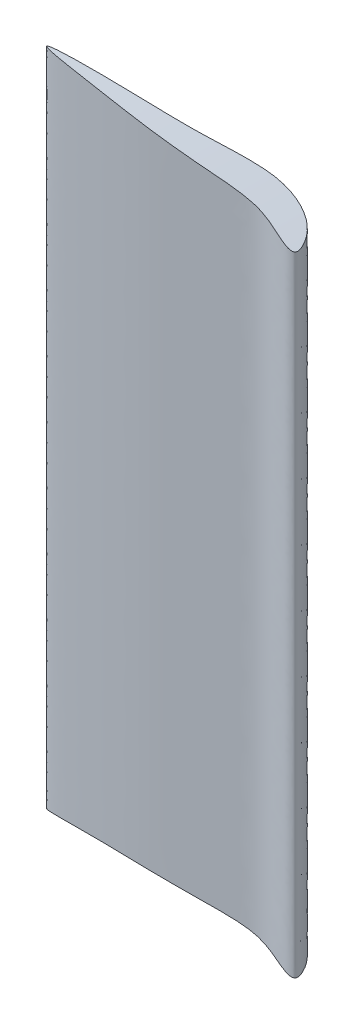
ISO-10303-21;
HEADER;
FILE_DESCRIPTION(('STEP AP214'),'2;1');
FILE_NAME('part.step','',(''),(''),'','','');
FILE_SCHEMA(('AUTOMOTIVE_DESIGN { 1 0 10303 214 1 1 1 1 }'));
ENDSEC;
DATA;
#1=APPLICATION_CONTEXT('core data for automotive mechanical design processes');
#2=APPLICATION_PROTOCOL_DEFINITION('international standard','automotive_design',2000,#1);
#3=PRODUCT_CONTEXT('',#1,'mechanical');
#4=PRODUCT('Part','Part','',(#3));
#5=PRODUCT_RELATED_PRODUCT_CATEGORY('part','',(#4));
#6=PRODUCT_DEFINITION_FORMATION('','',#4);
#7=PRODUCT_DEFINITION_CONTEXT('part definition',#1,'design');
#8=PRODUCT_DEFINITION('design','',#6,#7);
#9=PRODUCT_DEFINITION_SHAPE('','',#8);
#10=(LENGTH_UNIT() NAMED_UNIT(*) SI_UNIT(.MILLI.,.METRE.));
#11=(NAMED_UNIT(*) PLANE_ANGLE_UNIT() SI_UNIT($,.RADIAN.));
#12=(NAMED_UNIT(*) SI_UNIT($,.STERADIAN.) SOLID_ANGLE_UNIT());
#13=UNCERTAINTY_MEASURE_WITH_UNIT(LENGTH_MEASURE(1.E-05),#10,'distance_accuracy_value','');
#14=(GEOMETRIC_REPRESENTATION_CONTEXT(3) GLOBAL_UNCERTAINTY_ASSIGNED_CONTEXT((#13)) GLOBAL_UNIT_ASSIGNED_CONTEXT((#10,
#11,#12)) REPRESENTATION_CONTEXT('',''));
#15=CARTESIAN_POINT('',(0.,0.,0.));
#16=DIRECTION('',(0.,0.,1.));
#17=DIRECTION('',(1.,0.,0.));
#18=AXIS2_PLACEMENT_3D('',#15,#16,#17);
#19=CARTESIAN_POINT('',(-3.56013832817807,-13.0754050341932,21.6046688254635));
#20=DIRECTION('',(0.,0.,-1.));
#21=DIRECTION('',(-1.,0.,0.));
#22=AXIS2_PLACEMENT_3D('',#19,#20,#21);
#23=CYLINDRICAL_SURFACE('',#22,27.25);
#24=CARTESIAN_POINT('',(5.,12.7951676653521,-0.750000000000001));
#25=CARTESIAN_POINT('',(4.99909646395222,12.7954666276233,-0.746379155248309));
#26=CARTESIAN_POINT('',(4.99792977551534,12.795852621034,-0.742828291818252));
#27=CARTESIAN_POINT('',(4.99501188741267,12.7968176608269,-0.73600450233631));
#28=CARTESIAN_POINT('',(4.99326154238918,12.7973964249355,-0.732731178625141));
#29=CARTESIAN_POINT('',(4.9891981271379,12.7987394085068,-0.726586410781573));
#30=CARTESIAN_POINT('',(4.98688377777271,12.7995040495202,-0.723715903875301));
#31=CARTESIAN_POINT('',(4.98179633123377,12.8011839925103,-0.718460845472457));
#32=CARTESIAN_POINT('',(4.9790221821627,12.8020996399243,-0.716077436908573));
#33=CARTESIAN_POINT('',(4.96860712719981,12.8055350739611,-0.708488463252215));
#34=CARTESIAN_POINT('',(4.96009109767334,12.8083402906077,-0.704638921559748));
#35=CARTESIAN_POINT('',(4.94306251810073,12.8139393851933,-0.699258508853822));
#36=CARTESIAN_POINT('',(4.9345741578826,12.8167258402116,-0.69761460526237));
#37=CARTESIAN_POINT('',(4.91744380331384,12.8223396986373,-0.695485215199758));
#38=CARTESIAN_POINT('',(4.90880140367437,12.8251672046814,-0.695003459332361));
#39=CARTESIAN_POINT('',(4.88367359157393,12.8333741990826,-0.694706329361638));
#40=CARTESIAN_POINT('',(4.86718752445583,12.8387412059714,-0.69589232741417));
#41=CARTESIAN_POINT('',(4.83434291598546,12.8493993902257,-0.699670235252838));
#42=CARTESIAN_POINT('',(4.81798483106063,12.8546903276383,-0.702265880013931));
#43=CARTESIAN_POINT('',(4.78529258662157,12.8652306489867,-0.708337780627159));
#44=CARTESIAN_POINT('',(4.76895937444478,12.8704794927223,-0.711820000758437));
#45=CARTESIAN_POINT('',(4.73642120859475,12.880902313215,-0.719328953715338));
#46=CARTESIAN_POINT('',(4.72021612360606,12.8860763729015,-0.723355022357228));
#47=CARTESIAN_POINT('',(4.66119933829671,12.9048592466678,-0.738673252443498));
#48=CARTESIAN_POINT('',(4.61860834055863,12.9182979753019,-0.75099276162899));
#49=CARTESIAN_POINT('',(4.53336259081329,12.9449665750558,-0.775673230856061));
#50=CARTESIAN_POINT('',(4.49070782369475,12.9581963833357,-0.788034202062603));
#51=CARTESIAN_POINT('',(4.40484357676347,12.9845944189582,-0.810581022017345));
#52=CARTESIAN_POINT('',(4.36163483047189,12.997762701438,-0.820769484135516));
#53=CARTESIAN_POINT('',(4.27499582407334,13.0239283409396,-0.838103192424338));
#54=CARTESIAN_POINT('',(4.23157136471984,13.036926148387,-0.845275869184779));
#55=CARTESIAN_POINT('',(4.14415865653623,13.0628501631027,-0.855748446837888));
#56=CARTESIAN_POINT('',(4.10016979429247,13.0757762658686,-0.859043695169843));
#57=CARTESIAN_POINT('',(4.01200600693278,13.1014404977618,-0.861686942529994));
#58=CARTESIAN_POINT('',(3.96783096704147,13.1141784786863,-0.861031980189812));
#59=CARTESIAN_POINT('',(3.85806929088971,13.1455284864554,-0.856059070193697));
#60=CARTESIAN_POINT('',(3.7925256970753,13.1639820719973,-0.850113490177182));
#61=CARTESIAN_POINT('',(3.66162703648165,13.2003105251733,-0.834929685093589));
#62=CARTESIAN_POINT('',(3.59627225829291,13.2181847303501,-0.82568782657496));
#63=CARTESIAN_POINT('',(3.46555583080821,13.253413973561,-0.805617018419804));
#64=CARTESIAN_POINT('',(3.40019435221056,13.2707680949965,-0.794785444814362));
#65=CARTESIAN_POINT('',(3.26934601648219,13.3049895839862,-0.77292613038201));
#66=CARTESIAN_POINT('',(3.20385911666969,13.321856732754,-0.761898304872089));
#67=CARTESIAN_POINT('',(3.07178691614817,13.3553490225085,-0.740892511558806));
#68=CARTESIAN_POINT('',(3.00519791793277,13.3719687587286,-0.730928875696276));
#69=CARTESIAN_POINT('',(2.87178119546863,13.4047314341489,-0.71225858611939));
#70=CARTESIAN_POINT('',(2.80495368453999,13.4208747173442,-0.70355100696254));
#71=CARTESIAN_POINT('',(2.67106828403673,13.4526800002158,-0.687392898089642));
#72=CARTESIAN_POINT('',(2.60401052736368,13.4683422380701,-0.679941737806237));
#73=CARTESIAN_POINT('',(2.46967001273835,13.4991817025374,-0.666333638931673));
#74=CARTESIAN_POINT('',(2.40238731350046,13.5143590462305,-0.66017638588692));
#75=CARTESIAN_POINT('',(2.24582471241447,13.5490505165101,-0.647492420946518));
#76=CARTESIAN_POINT('',(2.15646087856322,13.5683815723119,-0.641489027442112));
#77=CARTESIAN_POINT('',(1.97739693138405,13.6061724688391,-0.631998448692735));
#78=CARTESIAN_POINT('',(1.88769674438955,13.6246321050291,-0.628511851460568));
#79=CARTESIAN_POINT('',(1.70804968273522,13.6606584447525,-0.623493584442226));
#80=CARTESIAN_POINT('',(1.61810276278351,13.6782249709136,-0.621962301537935));
#81=CARTESIAN_POINT('',(1.43795027565372,13.7124658170423,-0.620089058999525));
#82=CARTESIAN_POINT('',(1.3477445532182,13.7291393624964,-0.619748115851321));
#83=CARTESIAN_POINT('',(1.16718048068616,13.7615726242201,-0.619810742835714));
#84=CARTESIAN_POINT('',(1.07682214933087,13.7773324453391,-0.620214227370588));
#85=CARTESIAN_POINT('',(0.895963924453455,13.8079367085796,-0.621892001030408));
#86=CARTESIAN_POINT('',(0.805464041882286,13.8227812182382,-0.623166225822893));
#87=CARTESIAN_POINT('',(0.681012756823549,13.8425502224724,-0.625744056756712));
#88=CARTESIAN_POINT('',(0.647112900128085,13.8478695519968,-0.626530328247709));
#89=CARTESIAN_POINT('',(0.579297669197037,13.8583794559965,-0.628311085396864));
#90=CARTESIAN_POINT('',(0.545382294579101,13.8635700271036,-0.629305576495489));
#91=CARTESIAN_POINT('',(0.477610877064721,13.8738111574515,-0.6315526673942));
#92=CARTESIAN_POINT('',(0.443754857310266,13.8788619852003,-0.632804726601933));
#93=CARTESIAN_POINT('',(0.376041102440869,13.8888335530318,-0.635657634823828));
#94=CARTESIAN_POINT('',(0.342183367692001,13.893754303708,-0.63725845533613));
#95=CARTESIAN_POINT('',(0.274505629583958,13.9034602671461,-0.640957902023849));
#96=CARTESIAN_POINT('',(0.240685620288402,13.908245601048,-0.643056066447203));
#97=CARTESIAN_POINT('',(0.189908790665512,13.9153330186661,-0.646856368945806));
#98=CARTESIAN_POINT('',(0.172935129180658,13.9176858571621,-0.648236026688929));
#99=CARTESIAN_POINT('',(0.139019732124722,13.9223545462502,-0.651312418336699));
#100=CARTESIAN_POINT('',(0.122077984073553,13.9246704166184,-0.653008976094114));
#101=CARTESIAN_POINT('',(0.0966744874689424,13.9281186886159,-0.655952362462931));
#102=CARTESIAN_POINT('',(0.0881923061202095,13.9292659806761,-0.657002257476989));
#103=CARTESIAN_POINT('',(0.0712406120565443,13.9315507410149,-0.659293575926313));
#104=CARTESIAN_POINT('',(0.0627711316109321,13.9326881940466,-0.660535254458813));
#105=CARTESIAN_POINT('',(0.0459304618277254,13.9349418619253,-0.663294400007224));
#106=CARTESIAN_POINT('',(0.0375589939558339,13.9360581679367,-0.664809966964887));
#107=CARTESIAN_POINT('',(0.0250900227714326,13.937715023305,-0.667475843453759));
#108=CARTESIAN_POINT('',(0.0209522441959001,13.9382638678904,-0.668428812655791));
#109=CARTESIAN_POINT('',(0.0127288728847192,13.9393527313213,-0.670538647323165));
#110=CARTESIAN_POINT('',(0.00864325065027068,13.9398927552089,-0.671695391509768));
#111=CARTESIAN_POINT('',(0.00145718019843158,13.9408409578635,-0.674080787835093));
#112=CARTESIAN_POINT('',(-0.0016645719886156,13.9412523060063,-0.675239299818359));
#113=CARTESIAN_POINT('',(-0.00623326638379141,13.9418535468494,-0.677324339770058));
#114=CARTESIAN_POINT('',(-0.00775022698634436,13.9420530429313,-0.678085660232067));
#115=CARTESIAN_POINT('',(-0.0106801910833384,13.9424381278512,-0.679784836382988));
#116=CARTESIAN_POINT('',(-0.0120932251267796,13.9426237207763,-0.680722639904285));
#117=CARTESIAN_POINT('',(-0.0147118236055057,13.9429674654599,-0.682934798694686));
#118=CARTESIAN_POINT('',(-0.0159162329164722,13.9431254644723,-0.684210934591915));
#119=CARTESIAN_POINT('',(-0.017115951514119,13.9432828066718,-0.686478785099908));
#120=CARTESIAN_POINT('',(-0.0174146993608403,13.943321977042,-0.687288365419194));
#121=CARTESIAN_POINT('',(-0.0177015018315447,13.9433595814469,-0.688969551945978));
#122=CARTESIAN_POINT('',(-0.0176881362279733,13.9433578292693,-0.689841423678693));
#123=CARTESIAN_POINT('',(-0.0173493194618228,13.9433134043675,-0.691677280660549));
#124=CARTESIAN_POINT('',(-0.0169670190189909,13.9432632775753,-0.692628787384737));
#125=CARTESIAN_POINT('',(-0.0156555264934681,13.9430912658564,-0.695013880996379));
#126=CARTESIAN_POINT('',(-0.0145309184371014,13.9429437232719,-0.696323604934911));
#127=CARTESIAN_POINT('',(-0.011409932167771,13.94253401552,-0.699370974479903));
#128=CARTESIAN_POINT('',(-0.00927565834688717,13.9422536202025,-0.700943973687052));
#129=CARTESIAN_POINT('',(-0.00483168514499193,13.9416691940571,-0.703832392101482));
#130=CARTESIAN_POINT('',(-0.00252083602509041,13.9413650079529,-0.70514588038549));
#131=CARTESIAN_POINT('',(0.00520089312903523,13.9403475064447,-0.709202099350695));
#132=CARTESIAN_POINT('',(0.0107792234075621,13.9396107865352,-0.7116122966117));
#133=CARTESIAN_POINT('',(0.0220741018301649,13.9381154149856,-0.716080570266496));
#134=CARTESIAN_POINT('',(0.0277909565368653,13.9373567138014,-0.718137764856718));
#135=CARTESIAN_POINT('',(0.0392971696570678,13.9358259199687,-0.722027831112293));
#136=CARTESIAN_POINT('',(0.0450864951031008,13.935053833352,-0.723860800963947));
#137=CARTESIAN_POINT('',(0.0567004381760866,13.9335011214369,-0.727374340843109));
#138=CARTESIAN_POINT('',(0.0625249993195196,13.9327205087153,-0.729055108291526));
#139=CARTESIAN_POINT('',(0.0915186464817325,13.9288251213927,-0.737150597262706));
#140=CARTESIAN_POINT('',(0.11488641763049,13.9256551422787,-0.742818548142926));
#141=CARTESIAN_POINT('',(0.161771587798066,13.9192323736185,-0.753506425517554));
#142=CARTESIAN_POINT('',(0.185289113445675,13.9159795041577,-0.75852569595495));
#143=CARTESIAN_POINT('',(0.2323637369589,13.9094053540474,-0.768157377691436));
#144=CARTESIAN_POINT('',(0.255920731740598,13.9060841767141,-0.772770354653343));
#145=CARTESIAN_POINT('',(0.303062174702812,13.8993748305779,-0.78173979684831));
#146=CARTESIAN_POINT('',(0.326646606533248,13.8959866914722,-0.786096372529107));
#147=CARTESIAN_POINT('',(0.397364720354375,13.8857324837403,-0.798890447340673));
#148=CARTESIAN_POINT('',(0.44453145144954,13.8787670974432,-0.807065677769432));
#149=CARTESIAN_POINT('',(0.538890027133664,13.8645790715397,-0.823040710862014));
#150=CARTESIAN_POINT('',(0.586081872408406,13.8573564245114,-0.830840502679252));
#151=CARTESIAN_POINT('',(0.727671856760571,13.8353049092452,-0.853926917834554));
#152=CARTESIAN_POINT('',(0.822062490002814,13.8200956495231,-0.868896805613091));
#153=CARTESIAN_POINT('',(1.01075126429691,13.788671773949,-0.898686858560211));
#154=CARTESIAN_POINT('',(1.10504933035695,13.7724566323261,-0.913506940638597));
#155=CARTESIAN_POINT('',(1.29342332822134,13.7390423390567,-0.943381271794302));
#156=CARTESIAN_POINT('',(1.38749928362866,13.7218432973648,-0.958435494569108));
#157=CARTESIAN_POINT('',(1.57541439477746,13.6864660507916,-0.989159617561903));
#158=CARTESIAN_POINT('',(1.66925341522248,13.6682873799997,-1.00482980975854));
#159=CARTESIAN_POINT('',(1.85658017350404,13.6309758597853,-1.03722483871247));
#160=CARTESIAN_POINT('',(1.95006784735773,13.6118428448401,-1.05394985855438));
#161=CARTESIAN_POINT('',(2.08989154877638,13.5824630590265,-1.08038977667913));
#162=CARTESIAN_POINT('',(2.13642715842252,13.5725573757443,-1.08942757452168));
#163=CARTESIAN_POINT('',(2.22933052057942,13.5525278111096,-1.10810532782919));
#164=CARTESIAN_POINT('',(2.27569827626376,13.5424039339078,-1.11774527184586));
#165=CARTESIAN_POINT('',(2.36817701198884,13.5219598584025,-1.13789594752362));
#166=CARTESIAN_POINT('',(2.4142881072706,13.5116397592679,-1.148406247876));
#167=CARTESIAN_POINT('',(2.50623753334982,13.4908104678877,-1.17038691479974));
#168=CARTESIAN_POINT('',(2.55207586626032,13.4803012771095,-1.18185727392336));
#169=CARTESIAN_POINT('',(2.65877402245069,13.4555495526321,-1.20967554806338));
#170=CARTESIAN_POINT('',(2.71952618842574,13.441234825915,-1.22637096144294));
#171=CARTESIAN_POINT('',(2.8406837448941,13.4122498359555,-1.26078318926706));
#172=CARTESIAN_POINT('',(2.90108895230671,13.3975794031366,-1.27850049666053));
#173=CARTESIAN_POINT('',(3.02183537498064,13.3678170072415,-1.31402047591177));
#174=CARTESIAN_POINT('',(3.08217647440064,13.3527246557791,-1.33182321302979));
#175=CARTESIAN_POINT('',(3.2027989637435,13.3221145035263,-1.36654312800983));
#176=CARTESIAN_POINT('',(3.26307996820101,13.3065981512171,-1.3834628569113));
#177=CARTESIAN_POINT('',(3.38389429753325,13.275056183735,-1.4156594187874));
#178=CARTESIAN_POINT('',(3.44442739256665,13.2590309696068,-1.43093750588886));
#179=CARTESIAN_POINT('',(3.56592956546806,13.226412567856,-1.45875283360053));
#180=CARTESIAN_POINT('',(3.62689797313743,13.2098201468321,-1.4712936165887));
#181=CARTESIAN_POINT('',(3.72318925636895,13.1832497547008,-1.48656077505481));
#182=CARTESIAN_POINT('',(3.75826128211786,13.1734970433452,-1.49118835998373));
#183=CARTESIAN_POINT('',(3.82857734547586,13.1537907961059,-1.49816104282779));
#184=CARTESIAN_POINT('',(3.86382136261887,13.1438372836951,-1.50050640596559));
#185=CARTESIAN_POINT('',(3.93434914687854,13.123764815394,-1.50270016956448));
#186=CARTESIAN_POINT('',(3.9696329189384,13.1136458361604,-1.50254821462381));
#187=CARTESIAN_POINT('',(4.04007044966479,13.0932914156546,-1.49976233071277));
#188=CARTESIAN_POINT('',(4.07522417126346,13.0830559441288,-1.49712774175224));
#189=CARTESIAN_POINT('',(4.18062015069483,13.0521382568805,-1.48533436665126));
#190=CARTESIAN_POINT('',(4.25044715015894,13.0313444304573,-1.47227387413858));
#191=CARTESIAN_POINT('',(4.38711747018695,12.9900645291789,-1.43461912445317));
#192=CARTESIAN_POINT('',(4.45396165177988,12.9695783666602,-1.41002821958056));
#193=CARTESIAN_POINT('',(4.56518666977838,12.9350555967931,-1.35597304330145));
#194=CARTESIAN_POINT('',(4.61089001644338,12.9207267279278,-1.32943717637048));
#195=CARTESIAN_POINT('',(4.69749285635278,12.8933469820322,-1.26894087488926));
#196=CARTESIAN_POINT('',(4.73840007118431,12.8802940565768,-1.23499263343773));
#197=CARTESIAN_POINT('',(4.81397775392866,12.8560098124852,-1.15963605390892));
#198=CARTESIAN_POINT('',(4.84860069698702,12.8447924331867,-1.11817525312602));
#199=CARTESIAN_POINT('',(4.90983332800602,12.8248483428845,-1.02917149914213));
#200=CARTESIAN_POINT('',(4.93644891797883,12.8161197976748,-0.981633062619219));
#201=CARTESIAN_POINT('',(4.96504977505443,12.8067067667094,-0.917724299338321));
#202=CARTESIAN_POINT('',(4.97108200007298,12.8047188749903,-0.903253945860582));
#203=CARTESIAN_POINT('',(4.98215441208671,12.8010663030141,-0.873901559547979));
#204=CARTESIAN_POINT('',(4.98719607452384,12.7994011421007,-0.85902017723783));
#205=CARTESIAN_POINT('',(4.99412818367349,12.7971099655734,-0.83439670710519));
#206=CARTESIAN_POINT('',(4.99649307079177,12.7963278616378,-0.824803395907994));
#207=CARTESIAN_POINT('',(5.0003031634218,12.795067431355,-0.805379141214577));
#208=CARTESIAN_POINT('',(5.00174735188383,12.7945894409481,-0.795547947336525));
#209=CARTESIAN_POINT('',(5.00278664078087,12.7942454485576,-0.779671863390836));
#210=CARTESIAN_POINT('',(5.00288717804436,12.7942121649746,-0.773667416908583));
#211=CARTESIAN_POINT('',(5.00221121247868,12.7944359151414,-0.761716181414018));
#212=CARTESIAN_POINT('',(5.00143964545401,12.7946913150441,-0.75576925812677));
#213=CARTESIAN_POINT('',(5.,12.7951676653521,-0.750000000000001));
#214=B_SPLINE_CURVE_WITH_KNOTS('',3,(#24,#25,#26,#27,#28,#29,#30,#31,#32,#33,#34,#35,#36,#37,
#38,#39,#40,#41,#42,#43,#44,#45,#46,#47,#48,#49,#50,#51,#52,#53,#54,#55,#56,#57,#58,#59,#60,#61,
#62,#63,#64,#65,#66,#67,#68,#69,#70,#71,#72,#73,#74,#75,#76,#77,#78,#79,#80,#81,#82,#83,#84,#85,
#86,#87,#88,#89,#90,#91,#92,#93,#94,#95,#96,#97,#98,#99,#100,#101,#102,#103,#104,#105,#106,#107,
#108,#109,#110,#111,#112,#113,#114,#115,#116,#117,#118,#119,#120,#121,#122,#123,#124,#125,#126,
#127,#128,#129,#130,#131,#132,#133,#134,#135,#136,#137,#138,#139,#140,#141,#142,#143,#144,#145,
#146,#147,#148,#149,#150,#151,#152,#153,#154,#155,#156,#157,#158,#159,#160,#161,#162,#163,#164,
#165,#166,#167,#168,#169,#170,#171,#172,#173,#174,#175,#176,#177,#178,#179,#180,#181,#182,#183,
#184,#185,#186,#187,#188,#189,#190,#191,#192,#193,#194,#195,#196,#197,#198,#199,#200,#201,#202,
#203,#204,#205,#206,#207,#208,#209,#210,#211,#212,#213),.UNSPECIFIED.,.T.,.F.,(4,2,2,2,2,2,2,2,
2,2,2,2,2,2,2,2,2,2,2,2,2,2,2,2,2,2,2,2,2,2,2,2,2,2,2,2,2,2,2,2,2,2,2,2,2,2,2,2,2,2,2,2,2,2,2,2,
2,2,2,2,2,2,2,2,2,2,2,2,2,2,2,2,2,2,2,2,2,2,2,2,2,2,2,2,2,2,2,2,2,2,2,2,2,2,4),(0.,
0.0112201473059598,0.0224239366902824,0.0336533762013682,0.0449088694947455,0.073620791127561,
0.100796594123832,0.128059518599822,0.180061382067646,0.232201705787661,0.284702516267818,
0.337139779398677,0.47610491545097,0.615111083078985,0.753949081140267,0.891495405058197,
1.02920660426923,1.16702105474703,1.37190992807754,1.57702534971053,1.78248322201574,
1.98803200932529,2.19607013451737,2.4039541889427,2.61173359865356,2.81946245393933,
3.09430347623922,3.36920869037744,3.64416828931402,3.91936263155688,4.19452533265933,
4.46966770625361,4.5726380608067,4.67561110615712,4.77837019386913,4.8811208869366,
4.98377655364394,5.03534921683043,5.08689329846685,5.11276237627163,5.13866616447255,
5.16439670411547,5.17723790609506,5.19007149116608,5.20011870827895,5.20523477877164,
5.21034933934511,5.21549137119635,5.21803503703175,5.22059027970031,5.22361467251102,
5.22873852285331,5.23669968278615,5.24471801541207,5.26304091551986,5.28140894033608,
5.29976889292163,5.31810467918367,5.39083037709563,5.46362906151479,5.53632473452614,
5.60898886034199,5.75410659567973,5.89922852101926,6.18953987389075,6.48000427138165,
6.77043627151721,7.06100764131703,7.35162958463067,7.49691344982092,7.64219455364854,
7.78740408878022,7.9326124975391,8.12642542944044,8.32033264917451,8.51442465843278,
8.70792076482881,8.90126798349846,9.09436348589934,9.20438923011952,9.3144021864474,
9.42443079922643,9.53448867056523,9.75568773569277,9.97682253023901,10.1404750008094,
10.3038602701022,10.4684338678287,10.6328858637532,10.6802825250155,10.7276080446933,
10.7573185128211,10.7870617440072,10.8050405662142,10.8229181418816),.UNSPECIFIED.);
#215=CARTESIAN_POINT('',(5.,12.7951676653521,-0.750000000000001));
#216=VERTEX_POINT('',#215);
#217=EDGE_CURVE('E36',#216,#216,#214,.T.);
#218=ORIENTED_EDGE('',*,*,#217,.F.);
#219=EDGE_LOOP('',(#218));
#220=FACE_BOUND('',#219,.T.);
#221=ADVANCED_FACE('F30',(#220),#23,.T.);
#222=CARTESIAN_POINT('',(5.,15.4,-0.750000000000001));
#223=CARTESIAN_POINT('',(5.01156507984351,15.4,-0.796443354299663));
#224=CARTESIAN_POINT('',(4.82697014007405,15.4,-1.35455656411424));
#225=CARTESIAN_POINT('',(4.13000747431442,15.4,-1.56715183301845));
#226=CARTESIAN_POINT('',(3.46957990101982,15.4,-1.44305268056117));
#227=CARTESIAN_POINT('',(2.95638543657894,15.4,-1.29672152310591));
#228=CARTESIAN_POINT('',(1.95803660999976,15.4,-0.98983957626885));
#229=CARTESIAN_POINT('',(-1.13475011850877,15.4,-0.651906211318544));
#230=CARTESIAN_POINT('',(1.33340208449002,15.4,-0.609733098193862));
#231=CARTESIAN_POINT('',(2.25155813427031,15.4,-0.6357118794803));
#232=CARTESIAN_POINT('',(3.12820594018932,15.4,-0.73866621293129));
#233=CARTESIAN_POINT('',(3.87649682790649,15.4,-0.88723632370867));
#234=CARTESIAN_POINT('',(4.4016000448626,15.4,-0.838463984237756));
#235=CARTESIAN_POINT('',(4.97042476372094,15.4,-0.631230981922265));
#236=CARTESIAN_POINT('',(5.,15.4,-0.750000000000001));
#237=B_SPLINE_CURVE_WITH_KNOTS('',3,(#222,#223,#224,#225,#226,#227,#228,#229,#230,#231,#232,
#233,#234,#235,#236),.UNSPECIFIED.,.T.,.F.,(4,1,1,1,1,1,1,1,1,1,1,1,4),(0.,0.0196779196279788,
0.137076217599986,0.17308602530479,0.21607145999024,0.287020657712134,0.517129769042713,
0.646238292011918,0.74115499156904,0.818777990582595,0.897221632681503,0.949677898436276,1.),.UNSPECIFIED.);
#238=DIRECTION('',(0.,-1.,0.));
#239=VECTOR('',#238,1.);
#240=SURFACE_OF_LINEAR_EXTRUSION('',#237,#239);
#241=ORIENTED_EDGE('',*,*,#217,.T.);
#242=EDGE_LOOP('',(#241));
#243=FACE_BOUND('',#242,.T.);
#244=CARTESIAN_POINT('',(5.,0.000788529991647621,-0.750000000000001));
#245=CARTESIAN_POINT('',(4.99909619937593,0.00104725361115787,-0.746384876666224));
#246=CARTESIAN_POINT('',(4.99793217683347,0.00138040860063148,-0.742836278049159));
#247=CARTESIAN_POINT('',(4.99501524145414,0.00221464872222636,-0.736009979926861));
#248=CARTESIAN_POINT('',(4.9932628821147,0.00271557601589376,-0.732732029398374));
#249=CARTESIAN_POINT('',(4.98918775123718,0.00387935291666473,-0.726571898951707));
#250=CARTESIAN_POINT('',(4.98686355073993,0.00454260813868396,-0.723690739136374));
#251=CARTESIAN_POINT('',(4.98174628847241,0.0060012284262897,-0.718413512115119));
#252=CARTESIAN_POINT('',(4.97895219258089,0.0067968848319416,-0.716018541122271));
#253=CARTESIAN_POINT('',(4.96854302928339,0.00975694365778595,-0.708462123173605));
#254=CARTESIAN_POINT('',(4.96005254007013,0.0121644200272734,-0.704625256206776));
#255=CARTESIAN_POINT('',(4.94314918255644,0.0169387716454078,-0.699287323569743));
#256=CARTESIAN_POINT('',(4.93476590673733,0.0192984418212153,-0.697652879660863));
#257=CARTESIAN_POINT('',(4.91784150464295,0.0240451859386808,-0.695521053317994));
#258=CARTESIAN_POINT('',(4.90929995589817,0.0264323237850236,-0.695027361468012));
#259=CARTESIAN_POINT('',(4.88475357699973,0.0332675607505422,-0.694686179586859));
#260=CARTESIAN_POINT('',(4.86874400028905,0.0376953073439233,-0.695779270100532));
#261=CARTESIAN_POINT('',(4.83684146588296,0.0464591114244702,-0.699326560947503));
#262=CARTESIAN_POINT('',(4.82094893063452,0.0507948942820011,-0.701784367131107));
#263=CARTESIAN_POINT('',(4.78918040726408,0.0594033941392669,-0.707559470967366));
#264=CARTESIAN_POINT('',(4.77330534374765,0.0636754417308384,-0.710882767428823));
#265=CARTESIAN_POINT('',(4.74167947733264,0.0721278674694969,-0.718067841262647));
#266=CARTESIAN_POINT('',(4.72592854147598,0.0763083558713096,-0.721928924495791));
#267=CARTESIAN_POINT('',(4.66859095648554,0.091422073834123,-0.736635434167757));
#268=CARTESIAN_POINT('',(4.62721377902375,0.10212767244337,-0.748502811885756));
#269=CARTESIAN_POINT('',(4.54441660049279,0.123155716375863,-0.772474458177135));
#270=CARTESIAN_POINT('',(4.50299658846069,0.133477981510741,-0.784578834170547));
#271=CARTESIAN_POINT('',(4.41959385594324,0.153861368581867,-0.806885652987379));
#272=CARTESIAN_POINT('',(4.37761153947904,0.163922664211007,-0.817089390308882));
#273=CARTESIAN_POINT('',(4.29346368417318,0.183679881263696,-0.834717731857062));
#274=CARTESIAN_POINT('',(4.25130499086096,0.193378571080307,-0.842171089842583));
#275=CARTESIAN_POINT('',(4.16639244026291,0.212500898866452,-0.853526264753464));
#276=CARTESIAN_POINT('',(4.12363816042468,0.221924325149472,-0.85742541454264));
#277=CARTESIAN_POINT('',(4.05932835352098,0.235786571566394,-0.860423523721457));
#278=CARTESIAN_POINT('',(4.03785920702049,0.240362417462029,-0.860947673180384));
#279=CARTESIAN_POINT('',(3.99489494431552,0.249415895132971,-0.86114092206996));
#280=CARTESIAN_POINT('',(3.97339982603637,0.253893518427776,-0.860809947960336));
#281=CARTESIAN_POINT('',(3.92195168754326,0.264486681182831,-0.859176909750592));
#282=CARTESIAN_POINT('',(3.89199966512781,0.270553230393767,-0.857543900830506));
#283=CARTESIAN_POINT('',(3.83213071450629,0.282479325240684,-0.85323415162572));
#284=CARTESIAN_POINT('',(3.80221378978298,0.288338851778014,-0.850557315316638));
#285=CARTESIAN_POINT('',(3.7124443426584,0.305623011901881,-0.841315514086409));
#286=CARTESIAN_POINT('',(3.65265826852827,0.316735707934006,-0.833543439065632));
#287=CARTESIAN_POINT('',(3.53308227982444,0.338174854671967,-0.816255781867324));
#288=CARTESIAN_POINT('',(3.47329262823413,0.348499580523613,-0.806736521825542));
#289=CARTESIAN_POINT('',(3.35364605172797,0.368376668960705,-0.787086396698536));
#290=CARTESIAN_POINT('',(3.29378910828507,0.377928529857149,-0.776955141683813));
#291=CARTESIAN_POINT('',(3.20343048354026,0.391756946172332,-0.761989881526934));
#292=CARTESIAN_POINT('',(3.17299659861868,0.39631380621075,-0.757005421895168));
#293=CARTESIAN_POINT('',(3.11206109865043,0.405235702961207,-0.747285351175979));
#294=CARTESIAN_POINT('',(3.08155948402588,0.409600740865249,-0.742549738542158));
#295=CARTESIAN_POINT('',(2.99003155308384,0.422395940076505,-0.728749078468108));
#296=CARTESIAN_POINT('',(2.92890498640268,0.430537999221289,-0.720077188606405));
#297=CARTESIAN_POINT('',(2.806459605212,0.4460376238187,-0.70377988020316));
#298=CARTESIAN_POINT('',(2.74514096264005,0.45339575492726,-0.696153705952273));
#299=CARTESIAN_POINT('',(2.62230222304974,0.467325121893041,-0.681966709413811));
#300=CARTESIAN_POINT('',(2.5607821617373,0.473896490203365,-0.675405707735887));
#301=CARTESIAN_POINT('',(2.417785597418,0.48822790902815,-0.661449359847858));
#302=CARTESIAN_POINT('',(2.33623895473207,0.495692904131222,-0.654461686095989));
#303=CARTESIAN_POINT('',(2.1728449391749,0.50922840591046,-0.642592428609817));
#304=CARTESIAN_POINT('',(2.090997462786,0.515298375638832,-0.637711655192564));
#305=CARTESIAN_POINT('',(1.92710417480141,0.526028267163212,-0.629987260282316));
#306=CARTESIAN_POINT('',(1.84505833532301,0.530687977526812,-0.627143944166747));
#307=CARTESIAN_POINT('',(1.6809152456077,0.538585695506048,-0.623009575289323));
#308=CARTESIAN_POINT('',(1.59881806111104,0.541824604128478,-0.621717537872471));
#309=CARTESIAN_POINT('',(1.43457963718803,0.546881823426472,-0.620106592857301));
#310=CARTESIAN_POINT('',(1.3524384022153,0.548700257656128,-0.619787600615659));
#311=CARTESIAN_POINT('',(1.1881426299147,0.55091605327037,-0.619770831484245));
#312=CARTESIAN_POINT('',(1.10598809399691,0.551313518455281,-0.620073009216108));
#313=CARTESIAN_POINT('',(0.962408661676384,0.550766610060093,-0.621219359409747));
#314=CARTESIAN_POINT('',(0.900981146904065,0.550135365886892,-0.621907621820065));
#315=CARTESIAN_POINT('',(0.778144118918083,0.548078675501287,-0.623749343481566));
#316=CARTESIAN_POINT('',(0.716734606250677,0.546653207272109,-0.624902815628637));
#317=CARTESIAN_POINT('',(0.593995092122571,0.543010123898219,-0.627828151224474));
#318=CARTESIAN_POINT('',(0.53266506495976,0.540793041151349,-0.629599599037317));
#319=CARTESIAN_POINT('',(0.410075361540786,0.535568463973147,-0.63404708426557));
#320=CARTESIAN_POINT('',(0.348815677104621,0.53256107336459,-0.636723002873821));
#321=CARTESIAN_POINT('',(0.257032175662966,0.527461706838791,-0.642051937967977));
#322=CARTESIAN_POINT('',(0.226455425704665,0.525663876687142,-0.644047418939826));
#323=CARTESIAN_POINT('',(0.180636317220049,0.522821798161022,-0.647610149984928));
#324=CARTESIAN_POINT('',(0.165367954992849,0.521850011205542,-0.648892953309639));
#325=CARTESIAN_POINT('',(0.134864200837268,0.519859288299111,-0.651733183704393));
#326=CARTESIAN_POINT('',(0.11962880134443,0.518840364718922,-0.653290539017904));
#327=CARTESIAN_POINT('',(0.0891886536295946,0.51675548734894,-0.65682220422605));
#328=CARTESIAN_POINT('',(0.0739839522209893,0.515689486868486,-0.658796935768582));
#329=CARTESIAN_POINT('',(0.0512657948377598,0.514060351074114,-0.662390639176766));
#330=CARTESIAN_POINT('',(0.0437014266864373,0.513511798703177,-0.663695201976054));
#331=CARTESIAN_POINT('',(0.0286408963548557,0.512407602838842,-0.666644007797405));
#332=CARTESIAN_POINT('',(0.0211446665629661,0.511851968091131,-0.668287863988086));
#333=CARTESIAN_POINT('',(0.0100281509683618,0.51101932910727,-0.671311878737733));
#334=CARTESIAN_POINT('',(0.00633421093560643,0.51074117294431,-0.672416644001703));
#335=CARTESIAN_POINT('',(-0.000931511744410333,0.510191258271525,-0.674954233850798));
#336=CARTESIAN_POINT('',(-0.00450379895001788,0.509919475319495,-0.676385445339589));
#337=CARTESIAN_POINT('',(-0.00985699076232429,0.509510305414341,-0.679248819653807));
#338=CARTESIAN_POINT('',(-0.0117586973918528,0.509364525465104,-0.680426700222929));
#339=CARTESIAN_POINT('',(-0.0144441977014976,0.509158205789222,-0.68271683744942));
#340=CARTESIAN_POINT('',(-0.0153639367420103,0.509087434588544,-0.68365254513008));
#341=CARTESIAN_POINT('',(-0.0166433731952952,0.508988899007966,-0.685504041147893));
#342=CARTESIAN_POINT('',(-0.01708744810711,0.508954665755899,-0.686355244040383));
#343=CARTESIAN_POINT('',(-0.0176263067098426,0.508913119815134,-0.688182359957116));
#344=CARTESIAN_POINT('',(-0.0177179459587171,0.508906049475384,-0.689159315654112));
#345=CARTESIAN_POINT('',(-0.0175321349193654,0.508920378361733,-0.690914417245187));
#346=CARTESIAN_POINT('',(-0.0173096549933969,0.508937537514937,-0.691699918550656));
#347=CARTESIAN_POINT('',(-0.0164680169593097,0.509002408619257,-0.693719316559862));
#348=CARTESIAN_POINT('',(-0.0156792922950655,0.509063169040252,-0.694874962926155));
#349=CARTESIAN_POINT('',(-0.0136142091043605,0.509222019812667,-0.697327150383246));
#350=CARTESIAN_POINT('',(-0.012262564159614,0.509325834693705,-0.698550760994131));
#351=CARTESIAN_POINT('',(-0.00940699340653089,0.509544695582084,-0.700815321166251));
#352=CARTESIAN_POINT('',(-0.00790208394565087,0.509659813941124,-0.701854956190871));
#353=CARTESIAN_POINT('',(-0.00326603631566691,0.510013656630969,-0.704798503912026));
#354=CARTESIAN_POINT('',(-2.2256337977931E-05,0.510260199853759,-0.706519450148471));
#355=CARTESIAN_POINT('',(0.00658390528631297,0.510759921298836,-0.709719275423624));
#356=CARTESIAN_POINT('',(0.00994657619254267,0.511013115253982,-0.711197506480519));
#357=CARTESIAN_POINT('',(0.0201319465353412,0.511776303255007,-0.71540199634765));
#358=CARTESIAN_POINT('',(0.0270493918970649,0.51228970381083,-0.717896685575038));
#359=CARTESIAN_POINT('',(0.0477906884290559,0.51381353503087,-0.72487923556325));
#360=CARTESIAN_POINT('',(0.0617539129969712,0.514819103888384,-0.72893086920283));
#361=CARTESIAN_POINT('',(0.0898342020779711,0.516799198801022,-0.736522491964097));
#362=CARTESIAN_POINT('',(0.103951445263955,0.517773682146642,-0.74006179895151));
#363=CARTESIAN_POINT('',(0.132235263735777,0.519683475658116,-0.746816147462692));
#364=CARTESIAN_POINT('',(0.146401680840998,0.520618861283769,-0.750031832255388));
#365=CARTESIAN_POINT('',(0.174773828270964,0.522449491187131,-0.756252009461012));
#366=CARTESIAN_POINT('',(0.188979529957474,0.523344759178529,-0.759256627249038));
#367=CARTESIAN_POINT('',(0.231578134959413,0.525965147613846,-0.768033761283346));
#368=CARTESIAN_POINT('',(0.260020269087588,0.527629428440002,-0.773584997680743));
#369=CARTESIAN_POINT('',(0.316979521315419,0.530790539102902,-0.784341206885595));
#370=CARTESIAN_POINT('',(0.345496643301739,0.532287360077752,-0.789546161362074));
#371=CARTESIAN_POINT('',(0.431140753040567,0.536524101989047,-0.804828380826901));
#372=CARTESIAN_POINT('',(0.488340403787159,0.539009065347509,-0.814569089914238));
#373=CARTESIAN_POINT('',(0.602885864225918,0.54329276787141,-0.83363467886316));
#374=CARTESIAN_POINT('',(0.66023175899637,0.545090889540909,-0.842959177917693));
#375=CARTESIAN_POINT('',(0.774966125237544,0.547994547565631,-0.861394017466976));
#376=CARTESIAN_POINT('',(0.832354588784975,0.549100190610613,-0.870504390743678));
#377=CARTESIAN_POINT('',(1.00473016142276,0.551378845774138,-0.897760365730798));
#378=CARTESIAN_POINT('',(1.11974927309437,0.551506913125951,-0.915802199664882));
#379=CARTESIAN_POINT('',(1.34970018087548,0.548979953032328,-0.952355881451769));
#380=CARTESIAN_POINT('',(1.46463195959464,0.546324469666977,-0.970867805816378));
#381=CARTESIAN_POINT('',(1.69389734602568,0.538253770901001,-1.00896711634088));
#382=CARTESIAN_POINT('',(1.80823172847393,0.532846244005374,-1.02855137137915));
#383=CARTESIAN_POINT('',(1.97930968348456,0.522693975487372,-1.05953169703282));
#384=CARTESIAN_POINT('',(2.0362604764192,0.518970106641235,-1.07012487450067));
#385=CARTESIAN_POINT('',(2.149969737199,0.510850132335212,-1.09205993478332));
#386=CARTESIAN_POINT('',(2.20672821155348,0.506454049864525,-1.1034017919863));
#387=CARTESIAN_POINT('',(2.29939870438123,0.498719543865109,-1.12286963634134));
#388=CARTESIAN_POINT('',(2.33539575220268,0.495576795677327,-1.13066768389225));
#389=CARTESIAN_POINT('',(2.40723681746895,0.489030171872162,-1.14683588097413));
#390=CARTESIAN_POINT('',(2.44308083749289,0.485626300674203,-1.15520602082236));
#391=CARTESIAN_POINT('',(2.55036262321243,0.475029556036047,-1.18118794875051));
#392=CARTESIAN_POINT('',(2.62155286281513,0.467451321703722,-1.19967181616261));
#393=CARTESIAN_POINT('',(2.76374508209158,0.45123920202556,-1.2386303915176));
#394=CARTESIAN_POINT('',(2.83474302393338,0.442598943671969,-1.25911695058004));
#395=CARTESIAN_POINT('',(2.97644621678774,0.424275043106656,-1.30059402298256));
#396=CARTESIAN_POINT('',(3.04715148629904,0.414591467918076,-1.32158450388323));
#397=CARTESIAN_POINT('',(3.18933905257665,0.394026319477732,-1.36278023003289));
#398=CARTESIAN_POINT('',(3.2608225626562,0.383134641270739,-1.38297658562325));
#399=CARTESIAN_POINT('',(3.36842476771567,0.365894176268257,-1.4114670633457));
#400=CARTESIAN_POINT('',(3.40437390789592,0.359993538032656,-1.42066755585825));
#401=CARTESIAN_POINT('',(3.47641471307589,0.347883591992179,-1.4382983885369));
#402=CARTESIAN_POINT('',(3.51250639226312,0.341674252709868,-1.44672864991483));
#403=CARTESIAN_POINT('',(3.58453384550165,0.328994517188923,-1.46231247219959));
#404=CARTESIAN_POINT('',(3.62046753293509,0.322527377225518,-1.46947802822868));
#405=CARTESIAN_POINT('',(3.69258262499378,0.309259744839277,-1.48201816317793));
#406=CARTESIAN_POINT('',(3.72876394694741,0.302459359405492,-1.48739331264569));
#407=CARTESIAN_POINT('',(3.80125381546,0.28854120581776,-1.49582248461899));
#408=CARTESIAN_POINT('',(3.83756184865819,0.281424238107328,-1.49888204394863));
#409=CARTESIAN_POINT('',(3.91023953308768,0.266882558067244,-1.50235134976851));
#410=CARTESIAN_POINT('',(3.94660917107461,0.25945790539599,-1.5027616075466));
#411=CARTESIAN_POINT('',(4.01429918005197,0.24536371769736,-1.50108023753876));
#412=CARTESIAN_POINT('',(4.04563544621981,0.238728319928513,-1.4993203436268));
#413=CARTESIAN_POINT('',(4.1081111299075,0.225279897176984,-1.49378788787662));
#414=CARTESIAN_POINT('',(4.13925043298558,0.218466778945633,-1.49001424838129));
#415=CARTESIAN_POINT('',(4.20129736171529,0.204674589837934,-1.48036533735336));
#416=CARTESIAN_POINT('',(4.23220364234981,0.197694983083004,-1.47448206790002));
#417=CARTESIAN_POINT('',(4.29348221306554,0.183644677776601,-1.46052520686391));
#418=CARTESIAN_POINT('',(4.32385462851278,0.176574001305223,-1.45245213702473));
#419=CARTESIAN_POINT('',(4.41431638590188,0.155205511780225,-1.42465283030242));
#420=CARTESIAN_POINT('',(4.47336888100232,0.14083626452668,-1.40140226065232));
#421=CARTESIAN_POINT('',(4.58640955971244,0.112613175661875,-1.34466638699536));
#422=CARTESIAN_POINT('',(4.64040973054231,0.098758163699529,-1.31120615489683));
#423=CARTESIAN_POINT('',(4.72978738111514,0.0753365765216195,-1.24217504076487));
#424=CARTESIAN_POINT('',(4.7666624277219,0.0654920952979766,-1.20864034259695));
#425=CARTESIAN_POINT('',(4.83425060020039,0.0472018957100638,-1.13562434199379));
#426=CARTESIAN_POINT('',(4.8649799272297,0.0387525101870624,-1.09615916808083));
#427=CARTESIAN_POINT('',(4.90470412490739,0.0277176546879701,-1.0349895953739));
#428=CARTESIAN_POINT('',(4.91648979042319,0.0244252790351322,-1.01517011940196));
#429=CARTESIAN_POINT('',(4.93855637126011,0.0182342398437911,-0.974611867117642));
#430=CARTESIAN_POINT('',(4.94883490884134,0.0153361989403999,-0.953871704012745));
#431=CARTESIAN_POINT('',(4.967862800658,0.00995135046515954,-0.911520425808503));
#432=CARTESIAN_POINT('',(4.97660574779295,0.00746626814005749,-0.8899061038089));
#433=CARTESIAN_POINT('',(4.98776387339709,0.00428608370725558,-0.856730776102115));
#434=CARTESIAN_POINT('',(4.9911608782657,0.00331620320491289,-0.845529035305427));
#435=CARTESIAN_POINT('',(4.9969661443395,0.0016570129653431,-0.822858569268056));
#436=CARTESIAN_POINT('',(4.99937702963372,0.000966958646249694,-0.811390639547774));
#437=CARTESIAN_POINT('',(5.00207854314222,0.000193370499221478,-0.791481693190732));
#438=CARTESIAN_POINT('',(5.002775974326,-6.50160551673465E-06,-0.783101854137345));
#439=CARTESIAN_POINT('',(5.00272973650412,6.81404973711028E-06,-0.766371389218705));
#440=CARTESIAN_POINT('',(5.00200552238594,0.000214425485763306,-0.758021913883154));
#441=CARTESIAN_POINT('',(5.,0.000788529991647621,-0.750000000000001));
#442=B_SPLINE_CURVE_WITH_KNOTS('',3,(#244,#245,#246,#247,#248,#249,#250,#251,#252,#253,#254,
#255,#256,#257,#258,#259,#260,#261,#262,#263,#264,#265,#266,#267,#268,#269,#270,#271,#272,#273,
#274,#275,#276,#277,#278,#279,#280,#281,#282,#283,#284,#285,#286,#287,#288,#289,#290,#291,#292,
#293,#294,#295,#296,#297,#298,#299,#300,#301,#302,#303,#304,#305,#306,#307,#308,#309,#310,#311,
#312,#313,#314,#315,#316,#317,#318,#319,#320,#321,#322,#323,#324,#325,#326,#327,#328,#329,#330,
#331,#332,#333,#334,#335,#336,#337,#338,#339,#340,#341,#342,#343,#344,#345,#346,#347,#348,#349,
#350,#351,#352,#353,#354,#355,#356,#357,#358,#359,#360,#361,#362,#363,#364,#365,#366,#367,#368,
#369,#370,#371,#372,#373,#374,#375,#376,#377,#378,#379,#380,#381,#382,#383,#384,#385,#386,#387,
#388,#389,#390,#391,#392,#393,#394,#395,#396,#397,#398,#399,#400,#401,#402,#403,#404,#405,#406,
#407,#408,#409,#410,#411,#412,#413,#414,#415,#416,#417,#418,#419,#420,#421,#422,#423,#424,#425,
#426,#427,#428,#429,#430,#431,#432,#433,#434,#435,#436,#437,#438,#439,#440,#441),.UNSPECIFIED.,
.T.,.F.,(4,2,2,2,2,2,2,2,2,2,2,2,2,2,2,2,2,2,2,2,2,2,2,2,2,2,2,2,2,2,2,2,2,2,2,2,2,2,2,2,2,2,2,
2,2,2,2,2,2,2,2,2,2,2,2,2,2,2,2,2,2,2,2,2,2,2,2,2,2,2,2,2,2,2,2,2,2,2,2,2,2,2,2,2,2,2,2,2,2,2,2,
2,2,2,2,2,2,2,4),(0.,0.0111965224549073,0.0223825407878252,0.0335968006448611,0.04483607120291,
0.0731497732832239,0.0996574928255009,0.126250851322033,0.176063552703767,0.226008499786086,
0.276309286694417,0.326545740206426,0.459588619562408,0.592693264785142,0.725706920163084,
0.857287703702932,0.988967146529769,1.05482405663356,1.12068663059289,1.21247258634969,
1.30426698772672,1.48811639161431,1.67235733616499,1.85671693306154,1.95023842445443,
2.0437593346123,2.23056378261486,2.41723251267399,2.60386977235462,2.85038691006846,
3.09699877435594,3.34364759350525,3.59013977245606,3.8366105089155,4.08306324057368,
4.26736094314489,4.45166375490774,4.63584284715474,4.81999775587192,4.91207472967123,
4.95813131895605,5.00417588875113,5.0502671986165,5.07335258124537,5.09641178798791,
5.10800377720926,5.11953968141184,5.12621693883974,5.13011638981807,5.13294902118207,
5.13580686752509,5.13822205707371,5.14235434545725,5.14780674558157,5.15329665575137,
5.16431067534151,5.17535363730581,5.19744838647511,5.24114734874896,5.28490396888505,
5.32857182024314,5.37221350936618,5.45928808281671,5.5463672620343,5.72058709519092,
5.89496319178736,6.06931241575178,6.41855248337606,6.7678497622394,7.11617650740354,
7.2903117147405,7.46444096811619,7.57533371830439,7.68622459208208,7.9079978956456,
8.13117372752114,8.35433523101985,8.57952861152681,8.69224335685431,8.80496961907573,
8.91656137770776,9.02811754137485,9.13940611215274,9.25067320474299,9.3468514673122,
9.44308125142604,9.53967978248934,9.63625531809534,9.83057943304169,10.0244301345519,
10.1761853601092,10.3275351013548,10.3973530421882,10.4672799736489,10.5374920739794,
10.5727056689974,10.6078249403928,10.6330121641816,10.6578571087744),.UNSPECIFIED.);
#443=CARTESIAN_POINT('',(5.,0.000788529991647621,-0.750000000000001));
#444=VERTEX_POINT('',#443);
#445=EDGE_CURVE('E10',#444,#444,#442,.T.);
#446=ORIENTED_EDGE('',*,*,#445,.F.);
#447=EDGE_LOOP('',(#446));
#448=FACE_BOUND('',#447,.T.);
#449=ADVANCED_FACE('F32',(#243,#448),#240,.F.);
#450=CARTESIAN_POINT('',(1.07811990952822,-13.6988960122145,21.2196138056217));
#451=DIRECTION('',(0.,0.,-1.));
#452=DIRECTION('',(-1.,0.,0.));
#453=AXIS2_PLACEMENT_3D('',#450,#451,#452);
#454=CYLINDRICAL_SURFACE('',#453,14.25);
#455=ORIENTED_EDGE('',*,*,#445,.T.);
#456=EDGE_LOOP('',(#455));
#457=FACE_BOUND('',#456,.T.);
#458=ADVANCED_FACE('F51',(#457),#454,.F.);
#459=CLOSED_SHELL('',(#221,#449,#458));
#460=MANIFOLD_SOLID_BREP('B2',#459);
#461=ADVANCED_BREP_SHAPE_REPRESENTATION('',(#18,#460),#14);
#462=SHAPE_DEFINITION_REPRESENTATION(#9,#461);
ENDSEC;
END-ISO-10303-21;
